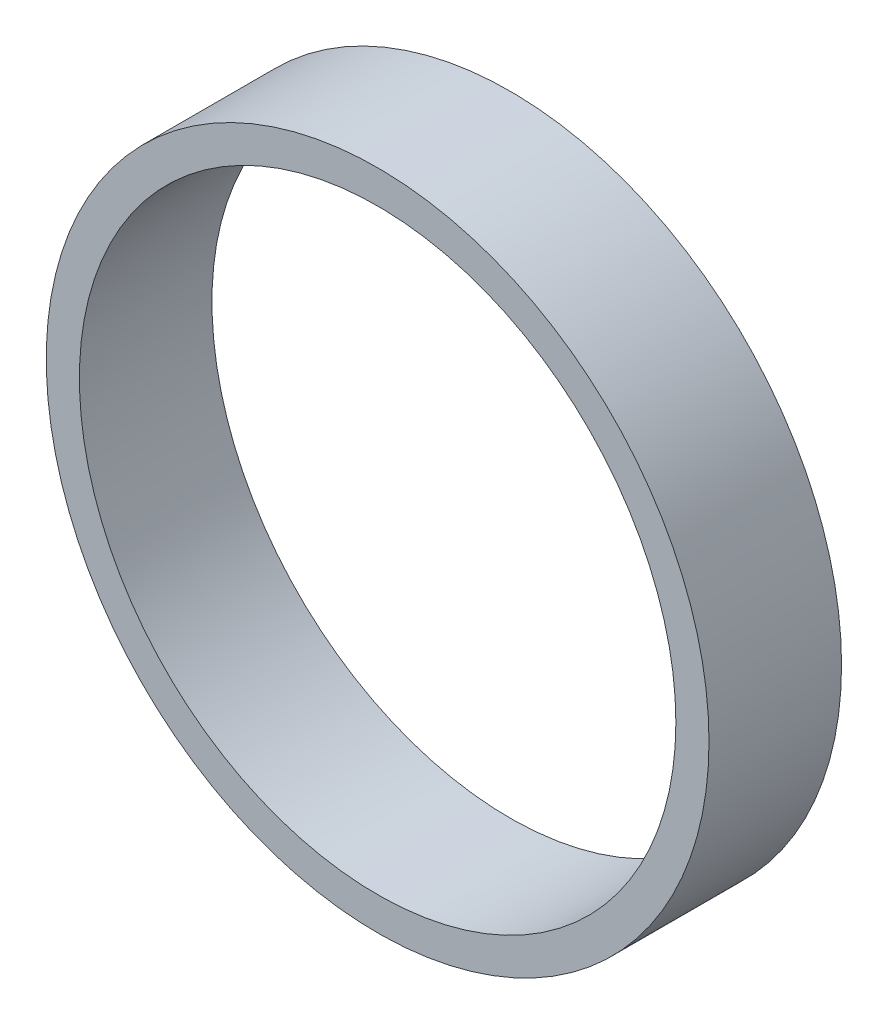
ISO-10303-21;
HEADER;
FILE_DESCRIPTION(('STEP AP214'),'2;1');
FILE_NAME('part.step','',(''),(''),'','','');
FILE_SCHEMA(('AUTOMOTIVE_DESIGN { 1 0 10303 214 1 1 1 1 }'));
ENDSEC;
DATA;
#1=APPLICATION_CONTEXT('core data for automotive mechanical design processes');
#2=APPLICATION_PROTOCOL_DEFINITION('international standard','automotive_design',2000,#1);
#3=PRODUCT_CONTEXT('',#1,'mechanical');
#4=PRODUCT('Part','Part','',(#3));
#5=PRODUCT_RELATED_PRODUCT_CATEGORY('part','',(#4));
#6=PRODUCT_DEFINITION_FORMATION('','',#4);
#7=PRODUCT_DEFINITION_CONTEXT('part definition',#1,'design');
#8=PRODUCT_DEFINITION('design','',#6,#7);
#9=PRODUCT_DEFINITION_SHAPE('','',#8);
#10=(LENGTH_UNIT() NAMED_UNIT(*) SI_UNIT(.MILLI.,.METRE.));
#11=(NAMED_UNIT(*) PLANE_ANGLE_UNIT() SI_UNIT($,.RADIAN.));
#12=(NAMED_UNIT(*) SI_UNIT($,.STERADIAN.) SOLID_ANGLE_UNIT());
#13=UNCERTAINTY_MEASURE_WITH_UNIT(LENGTH_MEASURE(1.E-05),#10,'distance_accuracy_value','');
#14=(GEOMETRIC_REPRESENTATION_CONTEXT(3) GLOBAL_UNCERTAINTY_ASSIGNED_CONTEXT((#13)) GLOBAL_UNIT_ASSIGNED_CONTEXT((#10,
#11,#12)) REPRESENTATION_CONTEXT('',''));
#15=CARTESIAN_POINT('',(0.,0.,0.));
#16=DIRECTION('',(0.,0.,1.));
#17=DIRECTION('',(1.,0.,0.));
#18=AXIS2_PLACEMENT_3D('',#15,#16,#17);
#19=CARTESIAN_POINT('',(0.,0.,12.7));
#20=DIRECTION('',(0.,0.,1.));
#21=DIRECTION('',(1.,0.,0.));
#22=AXIS2_PLACEMENT_3D('',#19,#20,#21);
#23=PLANE('',#22);
#24=CARTESIAN_POINT('',(0.,0.,12.7));
#25=DIRECTION('',(0.,0.,1.));
#26=DIRECTION('',(1.,0.,0.));
#27=AXIS2_PLACEMENT_3D('',#24,#25,#26);
#28=CIRCLE('',#27,31.75);
#29=CARTESIAN_POINT('',(31.75,0.,12.7));
#30=VERTEX_POINT('',#29);
#31=EDGE_CURVE('E10',#30,#30,#28,.T.);
#32=ORIENTED_EDGE('',*,*,#31,.T.);
#33=EDGE_LOOP('',(#32));
#34=FACE_BOUND('',#33,.T.);
#35=CARTESIAN_POINT('',(0.,0.,12.7));
#36=DIRECTION('',(0.,0.,1.));
#37=DIRECTION('',(1.,0.,0.));
#38=AXIS2_PLACEMENT_3D('',#35,#36,#37);
#39=CIRCLE('',#38,28.575);
#40=CARTESIAN_POINT('',(28.575,0.,12.7));
#41=VERTEX_POINT('',#40);
#42=EDGE_CURVE('E56',#41,#41,#39,.T.);
#43=ORIENTED_EDGE('',*,*,#42,.F.);
#44=EDGE_LOOP('',(#43));
#45=FACE_BOUND('',#44,.T.);
#46=ADVANCED_FACE('F43',(#34,#45),#23,.T.);
#47=CARTESIAN_POINT('',(0.,0.,0.));
#48=DIRECTION('',(0.,0.,1.));
#49=DIRECTION('',(1.,0.,0.));
#50=AXIS2_PLACEMENT_3D('',#47,#48,#49);
#51=PLANE('',#50);
#52=CARTESIAN_POINT('',(0.,0.,0.));
#53=DIRECTION('',(0.,0.,1.));
#54=DIRECTION('',(1.,0.,0.));
#55=AXIS2_PLACEMENT_3D('',#52,#53,#54);
#56=CIRCLE('',#55,31.75);
#57=CARTESIAN_POINT('',(31.75,0.,0.));
#58=VERTEX_POINT('',#57);
#59=EDGE_CURVE('E47',#58,#58,#56,.T.);
#60=ORIENTED_EDGE('',*,*,#59,.F.);
#61=EDGE_LOOP('',(#60));
#62=FACE_BOUND('',#61,.T.);
#63=CARTESIAN_POINT('',(0.,0.,0.));
#64=DIRECTION('',(0.,0.,1.));
#65=DIRECTION('',(1.,0.,0.));
#66=AXIS2_PLACEMENT_3D('',#63,#64,#65);
#67=CIRCLE('',#66,28.575);
#68=CARTESIAN_POINT('',(28.575,0.,0.));
#69=VERTEX_POINT('',#68);
#70=EDGE_CURVE('E58',#69,#69,#67,.T.);
#71=ORIENTED_EDGE('',*,*,#70,.T.);
#72=EDGE_LOOP('',(#71));
#73=FACE_BOUND('',#72,.T.);
#74=ADVANCED_FACE('F70',(#62,#73),#51,.F.);
#75=CARTESIAN_POINT('',(0.,0.,12.7));
#76=DIRECTION('',(0.,0.,-1.));
#77=DIRECTION('',(-1.,0.,0.));
#78=AXIS2_PLACEMENT_3D('',#75,#76,#77);
#79=CYLINDRICAL_SURFACE('',#78,31.75);
#80=ORIENTED_EDGE('',*,*,#31,.F.);
#81=EDGE_LOOP('',(#80));
#82=FACE_BOUND('',#81,.T.);
#83=ORIENTED_EDGE('',*,*,#59,.T.);
#84=EDGE_LOOP('',(#83));
#85=FACE_BOUND('',#84,.T.);
#86=ADVANCED_FACE('F45',(#82,#85),#79,.T.);
#87=CARTESIAN_POINT('',(0.,0.,12.7));
#88=DIRECTION('',(0.,0.,-1.));
#89=DIRECTION('',(-1.,0.,0.));
#90=AXIS2_PLACEMENT_3D('',#87,#88,#89);
#91=CYLINDRICAL_SURFACE('',#90,28.575);
#92=ORIENTED_EDGE('',*,*,#42,.T.);
#93=EDGE_LOOP('',(#92));
#94=FACE_BOUND('',#93,.T.);
#95=ORIENTED_EDGE('',*,*,#70,.F.);
#96=EDGE_LOOP('',(#95));
#97=FACE_BOUND('',#96,.T.);
#98=ADVANCED_FACE('F66',(#94,#97),#91,.F.);
#99=CLOSED_SHELL('',(#46,#74,#86,#98));
#100=MANIFOLD_SOLID_BREP('B2',#99);
#101=ADVANCED_BREP_SHAPE_REPRESENTATION('',(#18,#100),#14);
#102=SHAPE_DEFINITION_REPRESENTATION(#9,#101);
ENDSEC;
END-ISO-10303-21;
